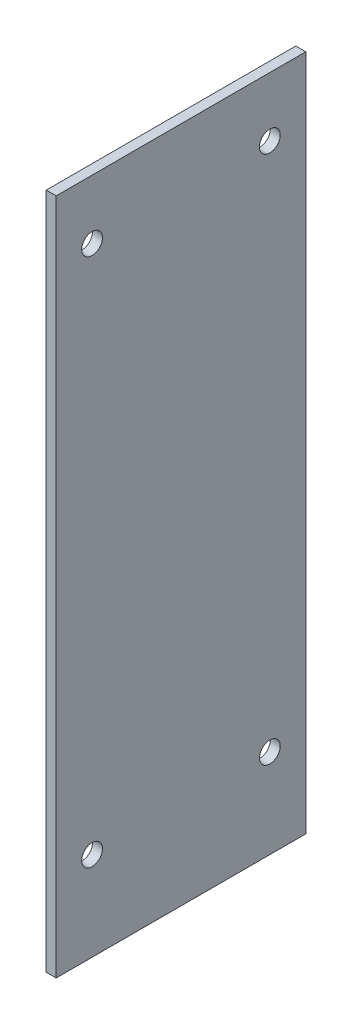
ISO-10303-21;
HEADER;
FILE_DESCRIPTION(('STEP AP214'),'2;1');
FILE_NAME('part.step','',(''),(''),'','','');
FILE_SCHEMA(('AUTOMOTIVE_DESIGN { 1 0 10303 214 1 1 1 1 }'));
ENDSEC;
DATA;
#1=APPLICATION_CONTEXT('core data for automotive mechanical design processes');
#2=APPLICATION_PROTOCOL_DEFINITION('international standard','automotive_design',2000,#1);
#3=PRODUCT_CONTEXT('',#1,'mechanical');
#4=PRODUCT('Part','Part','',(#3));
#5=PRODUCT_RELATED_PRODUCT_CATEGORY('part','',(#4));
#6=PRODUCT_DEFINITION_FORMATION('','',#4);
#7=PRODUCT_DEFINITION_CONTEXT('part definition',#1,'design');
#8=PRODUCT_DEFINITION('design','',#6,#7);
#9=PRODUCT_DEFINITION_SHAPE('','',#8);
#10=(LENGTH_UNIT() NAMED_UNIT(*) SI_UNIT(.MILLI.,.METRE.));
#11=(NAMED_UNIT(*) PLANE_ANGLE_UNIT() SI_UNIT($,.RADIAN.));
#12=(NAMED_UNIT(*) SI_UNIT($,.STERADIAN.) SOLID_ANGLE_UNIT());
#13=UNCERTAINTY_MEASURE_WITH_UNIT(LENGTH_MEASURE(1.E-05),#10,'distance_accuracy_value','');
#14=(GEOMETRIC_REPRESENTATION_CONTEXT(3) GLOBAL_UNCERTAINTY_ASSIGNED_CONTEXT((#13)) GLOBAL_UNIT_ASSIGNED_CONTEXT((#10,
#11,#12)) REPRESENTATION_CONTEXT('',''));
#15=CARTESIAN_POINT('',(0.,0.,0.));
#16=DIRECTION('',(0.,0.,1.));
#17=DIRECTION('',(1.,0.,0.));
#18=AXIS2_PLACEMENT_3D('',#15,#16,#17);
#19=CARTESIAN_POINT('',(1.68,0.,21.06));
#20=DIRECTION('',(0.,0.,-1.));
#21=DIRECTION('',(0.,1.,0.));
#22=AXIS2_PLACEMENT_3D('',#19,#20,#21);
#23=PLANE('',#22);
#24=DIRECTION('',(0.,-1.,0.));
#25=VECTOR('',#24,1.);
#26=CARTESIAN_POINT('',(0.,0.,21.06));
#27=LINE('',#26,#25);
#28=CARTESIAN_POINT('',(0.,114.3,21.06));
#29=VERTEX_POINT('',#28);
#30=CARTESIAN_POINT('',(0.,0.,21.06));
#31=VERTEX_POINT('',#30);
#32=EDGE_CURVE('E106',#29,#31,#27,.T.);
#33=ORIENTED_EDGE('',*,*,#32,.T.);
#34=DIRECTION('',(-1.,0.,0.));
#35=VECTOR('',#34,1.);
#36=CARTESIAN_POINT('',(1.68,0.,21.06));
#37=LINE('',#36,#35);
#38=CARTESIAN_POINT('',(1.68,0.,21.06));
#39=VERTEX_POINT('',#38);
#40=EDGE_CURVE('E11',#39,#31,#37,.T.);
#41=ORIENTED_EDGE('',*,*,#40,.F.);
#42=DIRECTION('',(0.,-1.,0.));
#43=VECTOR('',#42,1.);
#44=CARTESIAN_POINT('',(1.68,0.,21.06));
#45=LINE('',#44,#43);
#46=CARTESIAN_POINT('',(1.68,114.3,21.06));
#47=VERTEX_POINT('',#46);
#48=EDGE_CURVE('E94',#47,#39,#45,.T.);
#49=ORIENTED_EDGE('',*,*,#48,.F.);
#50=DIRECTION('',(-1.,0.,0.));
#51=VECTOR('',#50,1.);
#52=CARTESIAN_POINT('',(1.68,114.3,21.06));
#53=LINE('',#52,#51);
#54=EDGE_CURVE('E102',#47,#29,#53,.T.);
#55=ORIENTED_EDGE('',*,*,#54,.T.);
#56=EDGE_LOOP('',(#33,#41,#49,#55));
#57=FACE_BOUND('',#56,.T.);
#58=ADVANCED_FACE('F43',(#57),#23,.F.);
#59=CARTESIAN_POINT('',(1.68,0.,21.06));
#60=DIRECTION('',(0.,1.,0.));
#61=DIRECTION('',(0.,0.,1.));
#62=AXIS2_PLACEMENT_3D('',#59,#60,#61);
#63=PLANE('',#62);
#64=DIRECTION('',(0.,0.,-1.));
#65=VECTOR('',#64,1.);
#66=CARTESIAN_POINT('',(0.,0.,21.06));
#67=LINE('',#66,#65);
#68=CARTESIAN_POINT('',(0.,0.,-21.06));
#69=VERTEX_POINT('',#68);
#70=EDGE_CURVE('E98',#31,#69,#67,.T.);
#71=ORIENTED_EDGE('',*,*,#70,.T.);
#72=DIRECTION('',(-1.,0.,0.));
#73=VECTOR('',#72,1.);
#74=CARTESIAN_POINT('',(1.68,0.,-21.06));
#75=LINE('',#74,#73);
#76=CARTESIAN_POINT('',(1.68,0.,-21.06));
#77=VERTEX_POINT('',#76);
#78=EDGE_CURVE('E51',#77,#69,#75,.T.);
#79=ORIENTED_EDGE('',*,*,#78,.F.);
#80=DIRECTION('',(0.,0.,-1.));
#81=VECTOR('',#80,1.);
#82=CARTESIAN_POINT('',(1.68,0.,21.06));
#83=LINE('',#82,#81);
#84=EDGE_CURVE('E89',#39,#77,#83,.T.);
#85=ORIENTED_EDGE('',*,*,#84,.F.);
#86=ORIENTED_EDGE('',*,*,#40,.T.);
#87=EDGE_LOOP('',(#71,#79,#85,#86));
#88=FACE_BOUND('',#87,.T.);
#89=ADVANCED_FACE('F97',(#88),#63,.F.);
#90=CARTESIAN_POINT('',(1.68,0.,-21.06));
#91=DIRECTION('',(0.,0.,1.));
#92=DIRECTION('',(1.,0.,0.));
#93=AXIS2_PLACEMENT_3D('',#90,#91,#92);
#94=PLANE('',#93);
#95=DIRECTION('',(0.,1.,0.));
#96=VECTOR('',#95,1.);
#97=CARTESIAN_POINT('',(0.,0.,-21.06));
#98=LINE('',#97,#96);
#99=CARTESIAN_POINT('',(0.,114.3,-21.06));
#100=VERTEX_POINT('',#99);
#101=EDGE_CURVE('E76',#69,#100,#98,.T.);
#102=ORIENTED_EDGE('',*,*,#101,.T.);
#103=DIRECTION('',(-1.,0.,0.));
#104=VECTOR('',#103,1.);
#105=CARTESIAN_POINT('',(1.68,114.3,-21.06));
#106=LINE('',#105,#104);
#107=CARTESIAN_POINT('',(1.68,114.3,-21.06));
#108=VERTEX_POINT('',#107);
#109=EDGE_CURVE('E99',#108,#100,#106,.T.);
#110=ORIENTED_EDGE('',*,*,#109,.F.);
#111=DIRECTION('',(0.,1.,0.));
#112=VECTOR('',#111,1.);
#113=CARTESIAN_POINT('',(1.68,0.,-21.06));
#114=LINE('',#113,#112);
#115=EDGE_CURVE('E92',#77,#108,#114,.T.);
#116=ORIENTED_EDGE('',*,*,#115,.F.);
#117=ORIENTED_EDGE('',*,*,#78,.T.);
#118=EDGE_LOOP('',(#102,#110,#116,#117));
#119=FACE_BOUND('',#118,.T.);
#120=ADVANCED_FACE('F100',(#119),#94,.F.);
#121=CARTESIAN_POINT('',(1.68,114.3,21.06));
#122=DIRECTION('',(0.,-1.,0.));
#123=DIRECTION('',(0.,0.,-1.));
#124=AXIS2_PLACEMENT_3D('',#121,#122,#123);
#125=PLANE('',#124);
#126=DIRECTION('',(0.,0.,1.));
#127=VECTOR('',#126,1.);
#128=CARTESIAN_POINT('',(0.,114.3,21.06));
#129=LINE('',#128,#127);
#130=EDGE_CURVE('E82',#100,#29,#129,.T.);
#131=ORIENTED_EDGE('',*,*,#130,.T.);
#132=ORIENTED_EDGE('',*,*,#54,.F.);
#133=DIRECTION('',(0.,0.,1.));
#134=VECTOR('',#133,1.);
#135=CARTESIAN_POINT('',(1.68,114.3,21.06));
#136=LINE('',#135,#134);
#137=EDGE_CURVE('E59',#108,#47,#136,.T.);
#138=ORIENTED_EDGE('',*,*,#137,.F.);
#139=ORIENTED_EDGE('',*,*,#109,.T.);
#140=EDGE_LOOP('',(#131,#132,#138,#139));
#141=FACE_BOUND('',#140,.T.);
#142=ADVANCED_FACE('F114',(#141),#125,.F.);
#143=CARTESIAN_POINT('',(1.68,0.,0.));
#144=DIRECTION('',(-1.,0.,0.));
#145=DIRECTION('',(0.,0.,1.));
#146=AXIS2_PLACEMENT_3D('',#143,#144,#145);
#147=PLANE('',#146);
#148=CARTESIAN_POINT('',(1.68,15.,15.));
#149=DIRECTION('',(1.,0.,0.));
#150=DIRECTION('',(0.,0.,-1.));
#151=AXIS2_PLACEMENT_3D('',#148,#149,#150);
#152=CIRCLE('',#151,1.75);
#153=CARTESIAN_POINT('',(1.68,15.,13.25));
#154=VERTEX_POINT('',#153);
#155=EDGE_CURVE('E129',#154,#154,#152,.T.);
#156=ORIENTED_EDGE('',*,*,#155,.F.);
#157=EDGE_LOOP('',(#156));
#158=FACE_BOUND('',#157,.T.);
#159=CARTESIAN_POINT('',(1.68,15.,-15.));
#160=DIRECTION('',(1.,0.,0.));
#161=DIRECTION('',(0.,0.,-1.));
#162=AXIS2_PLACEMENT_3D('',#159,#160,#161);
#163=CIRCLE('',#162,1.74999999999999);
#164=CARTESIAN_POINT('',(1.68,15.,-16.75));
#165=VERTEX_POINT('',#164);
#166=EDGE_CURVE('E135',#165,#165,#163,.T.);
#167=ORIENTED_EDGE('',*,*,#166,.F.);
#168=EDGE_LOOP('',(#167));
#169=FACE_BOUND('',#168,.T.);
#170=CARTESIAN_POINT('',(1.68,104.3,-15.));
#171=DIRECTION('',(1.,0.,0.));
#172=DIRECTION('',(0.,0.,-1.));
#173=AXIS2_PLACEMENT_3D('',#170,#171,#172);
#174=CIRCLE('',#173,1.75);
#175=CARTESIAN_POINT('',(1.68,104.3,-16.75));
#176=VERTEX_POINT('',#175);
#177=EDGE_CURVE('E123',#176,#176,#174,.T.);
#178=ORIENTED_EDGE('',*,*,#177,.F.);
#179=EDGE_LOOP('',(#178));
#180=FACE_BOUND('',#179,.T.);
#181=CARTESIAN_POINT('',(1.68,104.3,15.));
#182=DIRECTION('',(1.,0.,0.));
#183=DIRECTION('',(0.,0.,-1.));
#184=AXIS2_PLACEMENT_3D('',#181,#182,#183);
#185=CIRCLE('',#184,1.75);
#186=CARTESIAN_POINT('',(1.68,104.3,13.25));
#187=VERTEX_POINT('',#186);
#188=EDGE_CURVE('E120',#187,#187,#185,.T.);
#189=ORIENTED_EDGE('',*,*,#188,.F.);
#190=EDGE_LOOP('',(#189));
#191=FACE_BOUND('',#190,.T.);
#192=ORIENTED_EDGE('',*,*,#48,.T.);
#193=ORIENTED_EDGE('',*,*,#84,.T.);
#194=ORIENTED_EDGE('',*,*,#115,.T.);
#195=ORIENTED_EDGE('',*,*,#137,.T.);
#196=EDGE_LOOP('',(#192,#193,#194,#195));
#197=FACE_BOUND('',#196,.T.);
#198=ADVANCED_FACE('F90',(#158,#169,#180,#191,#197),#147,.F.);
#199=CARTESIAN_POINT('',(0.,0.,0.));
#200=DIRECTION('',(-1.,0.,0.));
#201=DIRECTION('',(0.,0.,1.));
#202=AXIS2_PLACEMENT_3D('',#199,#200,#201);
#203=PLANE('',#202);
#204=CARTESIAN_POINT('',(0.,15.,15.));
#205=DIRECTION('',(1.,0.,0.));
#206=DIRECTION('',(0.,0.,-1.));
#207=AXIS2_PLACEMENT_3D('',#204,#205,#206);
#208=CIRCLE('',#207,1.75);
#209=CARTESIAN_POINT('',(0.,15.,13.25));
#210=VERTEX_POINT('',#209);
#211=EDGE_CURVE('E126',#210,#210,#208,.T.);
#212=ORIENTED_EDGE('',*,*,#211,.T.);
#213=EDGE_LOOP('',(#212));
#214=FACE_BOUND('',#213,.T.);
#215=CARTESIAN_POINT('',(0.,15.,-15.));
#216=DIRECTION('',(1.,0.,0.));
#217=DIRECTION('',(0.,0.,-1.));
#218=AXIS2_PLACEMENT_3D('',#215,#216,#217);
#219=CIRCLE('',#218,1.74999999999999);
#220=CARTESIAN_POINT('',(0.,15.,-16.75));
#221=VERTEX_POINT('',#220);
#222=EDGE_CURVE('E132',#221,#221,#219,.T.);
#223=ORIENTED_EDGE('',*,*,#222,.T.);
#224=EDGE_LOOP('',(#223));
#225=FACE_BOUND('',#224,.T.);
#226=CARTESIAN_POINT('',(0.,104.3,-15.));
#227=DIRECTION('',(1.,0.,0.));
#228=DIRECTION('',(0.,0.,-1.));
#229=AXIS2_PLACEMENT_3D('',#226,#227,#228);
#230=CIRCLE('',#229,1.75);
#231=CARTESIAN_POINT('',(0.,104.3,-16.75));
#232=VERTEX_POINT('',#231);
#233=EDGE_CURVE('E138',#232,#232,#230,.T.);
#234=ORIENTED_EDGE('',*,*,#233,.T.);
#235=EDGE_LOOP('',(#234));
#236=FACE_BOUND('',#235,.T.);
#237=CARTESIAN_POINT('',(0.,104.3,15.));
#238=DIRECTION('',(1.,0.,0.));
#239=DIRECTION('',(0.,0.,-1.));
#240=AXIS2_PLACEMENT_3D('',#237,#238,#239);
#241=CIRCLE('',#240,1.75);
#242=CARTESIAN_POINT('',(0.,104.3,13.25));
#243=VERTEX_POINT('',#242);
#244=EDGE_CURVE('E109',#243,#243,#241,.T.);
#245=ORIENTED_EDGE('',*,*,#244,.T.);
#246=EDGE_LOOP('',(#245));
#247=FACE_BOUND('',#246,.T.);
#248=ORIENTED_EDGE('',*,*,#32,.F.);
#249=ORIENTED_EDGE('',*,*,#130,.F.);
#250=ORIENTED_EDGE('',*,*,#101,.F.);
#251=ORIENTED_EDGE('',*,*,#70,.F.);
#252=EDGE_LOOP('',(#248,#249,#250,#251));
#253=FACE_BOUND('',#252,.T.);
#254=ADVANCED_FACE('F117',(#214,#225,#236,#247,#253),#203,.T.);
#255=CARTESIAN_POINT('',(0.,104.3,15.));
#256=DIRECTION('',(1.,0.,0.));
#257=DIRECTION('',(0.,0.,-1.));
#258=AXIS2_PLACEMENT_3D('',#255,#256,#257);
#259=CYLINDRICAL_SURFACE('',#258,1.75);
#260=ORIENTED_EDGE('',*,*,#244,.F.);
#261=EDGE_LOOP('',(#260));
#262=FACE_BOUND('',#261,.T.);
#263=ORIENTED_EDGE('',*,*,#188,.T.);
#264=EDGE_LOOP('',(#263));
#265=FACE_BOUND('',#264,.T.);
#266=ADVANCED_FACE('F152',(#262,#265),#259,.F.);
#267=CARTESIAN_POINT('',(0.,104.3,-15.));
#268=DIRECTION('',(1.,0.,0.));
#269=DIRECTION('',(0.,0.,-1.));
#270=AXIS2_PLACEMENT_3D('',#267,#268,#269);
#271=CYLINDRICAL_SURFACE('',#270,1.75);
#272=ORIENTED_EDGE('',*,*,#233,.F.);
#273=EDGE_LOOP('',(#272));
#274=FACE_BOUND('',#273,.T.);
#275=ORIENTED_EDGE('',*,*,#177,.T.);
#276=EDGE_LOOP('',(#275));
#277=FACE_BOUND('',#276,.T.);
#278=ADVANCED_FACE('F144',(#274,#277),#271,.F.);
#279=CARTESIAN_POINT('',(0.,15.,-15.));
#280=DIRECTION('',(1.,0.,0.));
#281=DIRECTION('',(0.,0.,-1.));
#282=AXIS2_PLACEMENT_3D('',#279,#280,#281);
#283=CYLINDRICAL_SURFACE('',#282,1.74999999999999);
#284=ORIENTED_EDGE('',*,*,#222,.F.);
#285=EDGE_LOOP('',(#284));
#286=FACE_BOUND('',#285,.T.);
#287=ORIENTED_EDGE('',*,*,#166,.T.);
#288=EDGE_LOOP('',(#287));
#289=FACE_BOUND('',#288,.T.);
#290=ADVANCED_FACE('F160',(#286,#289),#283,.F.);
#291=CARTESIAN_POINT('',(0.,15.,15.));
#292=DIRECTION('',(1.,0.,0.));
#293=DIRECTION('',(0.,0.,-1.));
#294=AXIS2_PLACEMENT_3D('',#291,#292,#293);
#295=CYLINDRICAL_SURFACE('',#294,1.75);
#296=ORIENTED_EDGE('',*,*,#211,.F.);
#297=EDGE_LOOP('',(#296));
#298=FACE_BOUND('',#297,.T.);
#299=ORIENTED_EDGE('',*,*,#155,.T.);
#300=EDGE_LOOP('',(#299));
#301=FACE_BOUND('',#300,.T.);
#302=ADVANCED_FACE('F208',(#298,#301),#295,.F.);
#303=CLOSED_SHELL('',(#58,#89,#120,#142,#198,#254,#266,#278,#290,#302));
#304=MANIFOLD_SOLID_BREP('B2',#303);
#305=ADVANCED_BREP_SHAPE_REPRESENTATION('',(#18,#304),#14);
#306=SHAPE_DEFINITION_REPRESENTATION(#9,#305);
ENDSEC;
END-ISO-10303-21;
